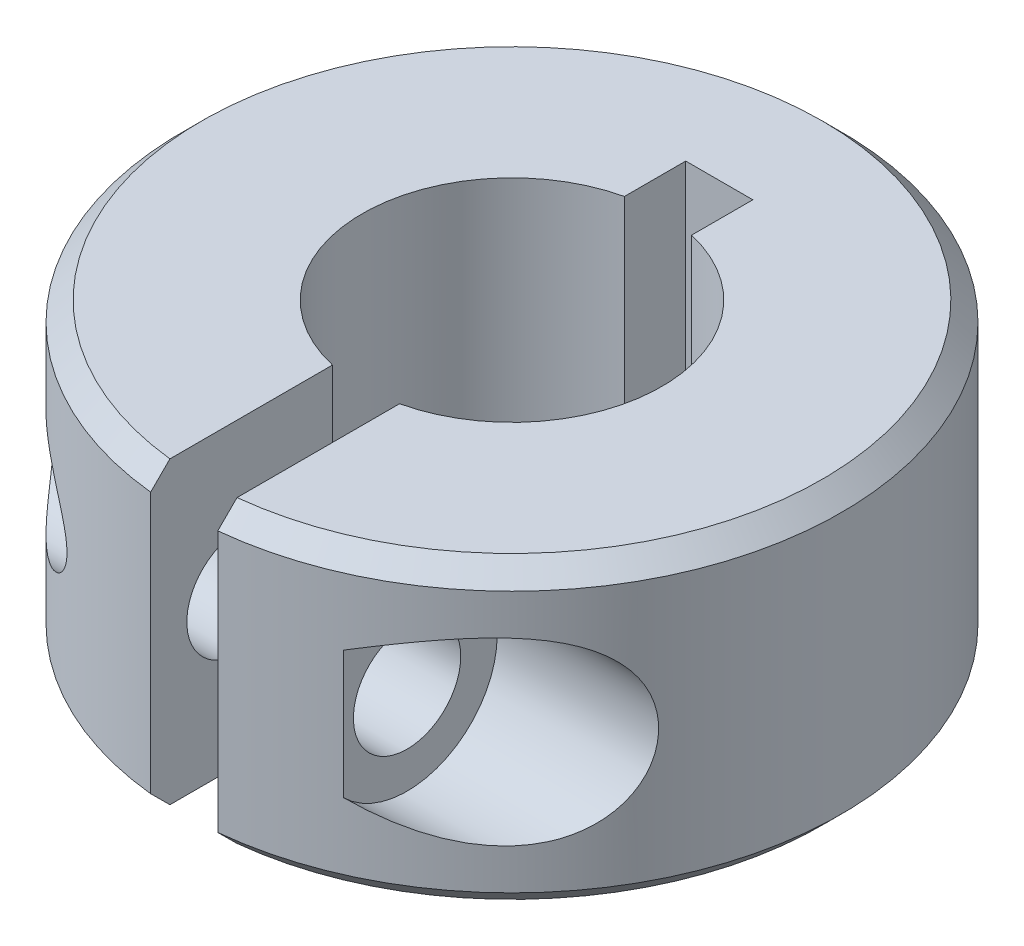
ISO-10303-21;
HEADER;
FILE_DESCRIPTION(('STEP AP214'),'2;1');
FILE_NAME('part.step','',(''),(''),'','','');
FILE_SCHEMA(('AUTOMOTIVE_DESIGN { 1 0 10303 214 1 1 1 1 }'));
ENDSEC;
DATA;
#1=APPLICATION_CONTEXT('core data for automotive mechanical design processes');
#2=APPLICATION_PROTOCOL_DEFINITION('international standard','automotive_design',2000,#1);
#3=PRODUCT_CONTEXT('',#1,'mechanical');
#4=PRODUCT('Part','Part','',(#3));
#5=PRODUCT_RELATED_PRODUCT_CATEGORY('part','',(#4));
#6=PRODUCT_DEFINITION_FORMATION('','',#4);
#7=PRODUCT_DEFINITION_CONTEXT('part definition',#1,'design');
#8=PRODUCT_DEFINITION('design','',#6,#7);
#9=PRODUCT_DEFINITION_SHAPE('','',#8);
#10=(LENGTH_UNIT() NAMED_UNIT(*) SI_UNIT(.MILLI.,.METRE.));
#11=(NAMED_UNIT(*) PLANE_ANGLE_UNIT() SI_UNIT($,.RADIAN.));
#12=(NAMED_UNIT(*) SI_UNIT($,.STERADIAN.) SOLID_ANGLE_UNIT());
#13=UNCERTAINTY_MEASURE_WITH_UNIT(LENGTH_MEASURE(1.E-05),#10,'distance_accuracy_value','');
#14=(GEOMETRIC_REPRESENTATION_CONTEXT(3) GLOBAL_UNCERTAINTY_ASSIGNED_CONTEXT((#13)) GLOBAL_UNIT_ASSIGNED_CONTEXT((#10,
#11,#12)) REPRESENTATION_CONTEXT('',''));
#15=CARTESIAN_POINT('',(0.,0.,0.));
#16=DIRECTION('',(0.,0.,1.));
#17=DIRECTION('',(1.,0.,0.));
#18=AXIS2_PLACEMENT_3D('',#15,#16,#17);
#19=CARTESIAN_POINT('',(0.889000000000001,0.,-3.86790066605904));
#20=DIRECTION('',(1.,0.,0.));
#21=DIRECTION('',(0.,0.,-1.));
#22=AXIS2_PLACEMENT_3D('',#19,#20,#21);
#23=PLANE('',#22);
#24=DIRECTION('',(0.,1.,0.));
#25=VECTOR('',#24,1.);
#26=CARTESIAN_POINT('',(0.889000000000001,0.,-5.49275));
#27=LINE('',#26,#25);
#28=CARTESIAN_POINT('',(0.889000000000001,7.9375,-5.49275));
#29=VERTEX_POINT('',#28);
#30=CARTESIAN_POINT('',(0.889000000000001,0.,-5.49275));
#31=VERTEX_POINT('',#30);
#32=EDGE_CURVE('E121',#29,#31,#27,.F.);
#33=ORIENTED_EDGE('',*,*,#32,.T.);
#34=DIRECTION('',(0.,0.,-1.));
#35=VECTOR('',#34,1.);
#36=CARTESIAN_POINT('',(0.889000000000001,0.,-3.86790066605904));
#37=LINE('',#36,#35);
#38=CARTESIAN_POINT('',(0.889000000000001,0.,-3.86790066605904));
#39=VERTEX_POINT('',#38);
#40=EDGE_CURVE('E107',#39,#31,#37,.T.);
#41=ORIENTED_EDGE('',*,*,#40,.F.);
#42=DIRECTION('',(0.,-1.,0.));
#43=VECTOR('',#42,1.);
#44=CARTESIAN_POINT('',(0.889000000000001,7.9375,-3.86790066605904));
#45=LINE('',#44,#43);
#46=CARTESIAN_POINT('',(0.889000000000001,7.9375,-3.86790066605904));
#47=VERTEX_POINT('',#46);
#48=EDGE_CURVE('E259',#39,#47,#45,.F.);
#49=ORIENTED_EDGE('',*,*,#48,.T.);
#50=DIRECTION('',(0.,0.,-1.));
#51=VECTOR('',#50,1.);
#52=CARTESIAN_POINT('',(0.889000000000001,7.9375,-3.86790066605904));
#53=LINE('',#52,#51);
#54=EDGE_CURVE('E118',#29,#47,#53,.F.);
#55=ORIENTED_EDGE('',*,*,#54,.F.);
#56=EDGE_LOOP('',(#33,#41,#49,#55));
#57=FACE_BOUND('',#56,.T.);
#58=ADVANCED_FACE('F16',(#57),#23,.F.);
#59=CARTESIAN_POINT('',(-8.73125,3.96875,6.30462390896852));
#60=DIRECTION('',(1.,0.,0.));
#61=DIRECTION('',(0.,0.,-1.));
#62=AXIS2_PLACEMENT_3D('',#59,#60,#61);
#63=CYLINDRICAL_SURFACE('',#62,1.4224);
#64=CARTESIAN_POINT('',(0.889000000000001,3.96875,6.30462390896852));
#65=DIRECTION('',(1.,0.,0.));
#66=DIRECTION('',(0.,0.,-1.));
#67=AXIS2_PLACEMENT_3D('',#64,#65,#66);
#68=CIRCLE('',#67,1.4224);
#69=CARTESIAN_POINT('',(0.889000000000001,3.96875,4.88222390896852));
#70=VERTEX_POINT('',#69);
#71=EDGE_CURVE('E19',#70,#70,#68,.F.);
#72=ORIENTED_EDGE('',*,*,#71,.T.);
#73=EDGE_LOOP('',(#72));
#74=FACE_BOUND('',#73,.T.);
#75=CARTESIAN_POINT('',(3.52425,3.96875,6.30462390896852));
#76=DIRECTION('',(1.,0.,0.));
#77=DIRECTION('',(0.,0.,-1.));
#78=AXIS2_PLACEMENT_3D('',#75,#76,#77);
#79=CIRCLE('',#78,1.4224);
#80=CARTESIAN_POINT('',(3.52425,3.96875,4.88222390896852));
#81=VERTEX_POINT('',#80);
#82=EDGE_CURVE('E209',#81,#81,#79,.F.);
#83=ORIENTED_EDGE('',*,*,#82,.F.);
#84=EDGE_LOOP('',(#83));
#85=FACE_BOUND('',#84,.T.);
#86=ADVANCED_FACE('F292',(#74,#85),#63,.F.);
#87=CARTESIAN_POINT('',(-0.889000000000001,0.,-3.86790066605904));
#88=DIRECTION('',(-1.,0.,0.));
#89=DIRECTION('',(0.,0.,1.));
#90=AXIS2_PLACEMENT_3D('',#87,#88,#89);
#91=PLANE('',#90);
#92=DIRECTION('',(0.,-1.,0.));
#93=VECTOR('',#92,1.);
#94=CARTESIAN_POINT('',(-0.889000000000003,7.9375,-3.86790066605904));
#95=LINE('',#94,#93);
#96=CARTESIAN_POINT('',(-0.889000000000002,7.9375,-3.86790066605904));
#97=VERTEX_POINT('',#96);
#98=CARTESIAN_POINT('',(-0.889000000000002,0.,-3.86790066605904));
#99=VERTEX_POINT('',#98);
#100=EDGE_CURVE('E131',#97,#99,#95,.T.);
#101=ORIENTED_EDGE('',*,*,#100,.T.);
#102=DIRECTION('',(0.,0.,1.));
#103=VECTOR('',#102,1.);
#104=CARTESIAN_POINT('',(-0.889000000000001,0.,-3.86790066605904));
#105=LINE('',#104,#103);
#106=CARTESIAN_POINT('',(-0.889000000000001,0.,-5.49275));
#107=VERTEX_POINT('',#106);
#108=EDGE_CURVE('E102',#107,#99,#105,.T.);
#109=ORIENTED_EDGE('',*,*,#108,.F.);
#110=DIRECTION('',(0.,1.,0.));
#111=VECTOR('',#110,1.);
#112=CARTESIAN_POINT('',(-0.889000000000001,0.,-5.49275));
#113=LINE('',#112,#111);
#114=CARTESIAN_POINT('',(-0.889000000000001,7.9375,-5.49275));
#115=VERTEX_POINT('',#114);
#116=EDGE_CURVE('E97',#107,#115,#113,.T.);
#117=ORIENTED_EDGE('',*,*,#116,.T.);
#118=DIRECTION('',(0.,0.,1.));
#119=VECTOR('',#118,1.);
#120=CARTESIAN_POINT('',(-0.889000000000001,7.9375,0.));
#121=LINE('',#120,#119);
#122=EDGE_CURVE('E245',#97,#115,#121,.F.);
#123=ORIENTED_EDGE('',*,*,#122,.F.);
#124=EDGE_LOOP('',(#101,#109,#117,#123));
#125=FACE_BOUND('',#124,.T.);
#126=ADVANCED_FACE('F294',(#125),#91,.F.);
#127=CARTESIAN_POINT('',(-0.889000000000001,0.,-5.49275));
#128=DIRECTION('',(0.,0.,-1.));
#129=DIRECTION('',(-1.,0.,0.));
#130=AXIS2_PLACEMENT_3D('',#127,#128,#129);
#131=PLANE('',#130);
#132=ORIENTED_EDGE('',*,*,#116,.F.);
#133=DIRECTION('',(1.,0.,0.));
#134=VECTOR('',#133,1.);
#135=CARTESIAN_POINT('',(0.,0.,-5.49275));
#136=LINE('',#135,#134);
#137=EDGE_CURVE('E112',#107,#31,#136,.T.);
#138=ORIENTED_EDGE('',*,*,#137,.T.);
#139=ORIENTED_EDGE('',*,*,#32,.F.);
#140=DIRECTION('',(1.,0.,0.));
#141=VECTOR('',#140,1.);
#142=CARTESIAN_POINT('',(0.,7.9375,-5.49275));
#143=LINE('',#142,#141);
#144=EDGE_CURVE('E248',#115,#29,#143,.T.);
#145=ORIENTED_EDGE('',*,*,#144,.F.);
#146=EDGE_LOOP('',(#132,#138,#139,#145));
#147=FACE_BOUND('',#146,.T.);
#148=ADVANCED_FACE('F125',(#147),#131,.F.);
#149=CARTESIAN_POINT('',(0.,7.9375,0.));
#150=DIRECTION('',(0.,-1.,0.));
#151=DIRECTION('',(0.,0.,-1.));
#152=AXIS2_PLACEMENT_3D('',#149,#150,#151);
#153=CYLINDRICAL_SURFACE('',#152,3.96875);
#154=CARTESIAN_POINT('',(0.,7.9375,0.));
#155=DIRECTION('',(0.,-1.,0.));
#156=DIRECTION('',(0.,0.,-1.));
#157=AXIS2_PLACEMENT_3D('',#154,#155,#156);
#158=CIRCLE('',#157,3.96875);
#159=CARTESIAN_POINT('',(0.889,7.9375,3.86790066605904));
#160=VERTEX_POINT('',#159);
#161=EDGE_CURVE('E267',#47,#160,#158,.T.);
#162=ORIENTED_EDGE('',*,*,#161,.F.);
#163=ORIENTED_EDGE('',*,*,#48,.F.);
#164=CARTESIAN_POINT('',(0.,0.,0.));
#165=DIRECTION('',(0.,-1.,0.));
#166=DIRECTION('',(0.,0.,-1.));
#167=AXIS2_PLACEMENT_3D('',#164,#165,#166);
#168=CIRCLE('',#167,3.96875);
#169=CARTESIAN_POINT('',(0.889,0.,3.86790066605904));
#170=VERTEX_POINT('',#169);
#171=EDGE_CURVE('E114',#39,#170,#168,.T.);
#172=ORIENTED_EDGE('',*,*,#171,.T.);
#173=DIRECTION('',(0.,1.,0.));
#174=VECTOR('',#173,1.);
#175=CARTESIAN_POINT('',(0.889,0.,3.86790066605904));
#176=LINE('',#175,#174);
#177=EDGE_CURVE('E257',#170,#160,#176,.T.);
#178=ORIENTED_EDGE('',*,*,#177,.T.);
#179=EDGE_LOOP('',(#162,#163,#172,#178));
#180=FACE_BOUND('',#179,.T.);
#181=ADVANCED_FACE('F194',(#180),#153,.F.);
#182=CARTESIAN_POINT('',(0.889,0.,3.86790066605904));
#183=DIRECTION('',(1.,0.,0.));
#184=DIRECTION('',(0.,0.,-1.));
#185=AXIS2_PLACEMENT_3D('',#182,#183,#184);
#186=PLANE('',#185);
#187=CARTESIAN_POINT('',(0.889,0.508000000000003,8.68587390896852));
#188=CARTESIAN_POINT('',(0.889,0.423319137776069,8.60075149357472));
#189=CARTESIAN_POINT('',(0.889,0.338645373339582,8.51562201956594));
#190=CARTESIAN_POINT('',(0.889,0.169312040006242,8.345348954283));
#191=CARTESIAN_POINT('',(0.889,0.0846524711093933,8.26020536300881));
#192=CARTESIAN_POINT('',(0.889,0.,8.17505471311966));
#193=B_SPLINE_CURVE_WITH_KNOTS('',3,(#187,#188,#189,#190,#191,#192),.UNSPECIFIED.,.F.,.F.,(4,2,
4),(0.,0.360208361312868,0.720416722775766),.UNSPECIFIED.);
#194=CARTESIAN_POINT('',(0.889,0.508000000000003,8.68587390896852));
#195=VERTEX_POINT('',#194);
#196=CARTESIAN_POINT('',(0.889,0.,8.17505471311966));
#197=VERTEX_POINT('',#196);
#198=EDGE_CURVE('E204',#195,#197,#193,.T.);
#199=ORIENTED_EDGE('',*,*,#198,.F.);
#200=DIRECTION('',(0.,-1.,0.));
#201=VECTOR('',#200,1.);
#202=CARTESIAN_POINT('',(0.888999999999999,7.9375,8.68587390896852));
#203=LINE('',#202,#201);
#204=CARTESIAN_POINT('',(0.889,7.4295,8.68587390896852));
#205=VERTEX_POINT('',#204);
#206=EDGE_CURVE('E273',#205,#195,#203,.T.);
#207=ORIENTED_EDGE('',*,*,#206,.F.);
#208=CARTESIAN_POINT('',(0.889,7.9375,8.17505471311966));
#209=CARTESIAN_POINT('',(0.889,7.85284752889061,8.26020536300882));
#210=CARTESIAN_POINT('',(0.889,7.76818795999376,8.345348954283));
#211=CARTESIAN_POINT('',(0.889,7.59885462666042,8.51562201956595));
#212=CARTESIAN_POINT('',(0.889,7.51418086222393,8.60075149357472));
#213=CARTESIAN_POINT('',(0.889,7.4295,8.68587390896852));
#214=B_SPLINE_CURVE_WITH_KNOTS('',3,(#208,#209,#210,#211,#212,#213),.UNSPECIFIED.,.F.,.F.,(4,2,
4),(0.,0.360208361462896,0.720416722775761),.UNSPECIFIED.);
#215=CARTESIAN_POINT('',(0.889,7.9375,8.17505471311966));
#216=VERTEX_POINT('',#215);
#217=EDGE_CURVE('E199',#216,#205,#214,.T.);
#218=ORIENTED_EDGE('',*,*,#217,.F.);
#219=DIRECTION('',(0.,0.,1.));
#220=VECTOR('',#219,1.);
#221=CARTESIAN_POINT('',(0.889,7.9375,0.));
#222=LINE('',#221,#220);
#223=EDGE_CURVE('E249',#160,#216,#222,.T.);
#224=ORIENTED_EDGE('',*,*,#223,.F.);
#225=ORIENTED_EDGE('',*,*,#177,.F.);
#226=DIRECTION('',(0.,0.,1.));
#227=VECTOR('',#226,1.);
#228=CARTESIAN_POINT('',(0.889,0.,0.));
#229=LINE('',#228,#227);
#230=EDGE_CURVE('E128',#170,#197,#229,.T.);
#231=ORIENTED_EDGE('',*,*,#230,.T.);
#232=EDGE_LOOP('',(#199,#207,#218,#224,#225,#231));
#233=FACE_BOUND('',#232,.T.);
#234=ORIENTED_EDGE('',*,*,#71,.F.);
#235=EDGE_LOOP('',(#234));
#236=FACE_BOUND('',#235,.T.);
#237=ADVANCED_FACE('F189',(#233,#236),#186,.F.);
#238=CARTESIAN_POINT('',(3.52425,3.96875,6.30462390896852));
#239=DIRECTION('',(1.,0.,0.));
#240=DIRECTION('',(0.,0.,-1.));
#241=AXIS2_PLACEMENT_3D('',#238,#239,#240);
#242=PLANE('',#241);
#243=CARTESIAN_POINT('',(3.52425,3.96875,6.30462390896852));
#244=DIRECTION('',(1.,0.,0.));
#245=DIRECTION('',(0.,0.,-1.));
#246=AXIS2_PLACEMENT_3D('',#243,#244,#245);
#247=CIRCLE('',#246,2.3876);
#248=CARTESIAN_POINT('',(3.52425,2.27595272289127,7.98839085798886));
#249=VERTEX_POINT('',#248);
#250=CARTESIAN_POINT('',(3.52425,5.66154727710873,7.98839085798886));
#251=VERTEX_POINT('',#250);
#252=EDGE_CURVE('E254',#249,#251,#247,.T.);
#253=ORIENTED_EDGE('',*,*,#252,.T.);
#254=DIRECTION('',(0.,-1.,0.));
#255=VECTOR('',#254,1.);
#256=CARTESIAN_POINT('',(3.52425,7.9375,7.98839085798886));
#257=LINE('',#256,#255);
#258=EDGE_CURVE('E176',#249,#251,#257,.F.);
#259=ORIENTED_EDGE('',*,*,#258,.F.);
#260=EDGE_LOOP('',(#253,#259));
#261=FACE_BOUND('',#260,.T.);
#262=ORIENTED_EDGE('',*,*,#82,.T.);
#263=EDGE_LOOP('',(#262));
#264=FACE_BOUND('',#263,.T.);
#265=ADVANCED_FACE('F184',(#261,#264),#242,.T.);
#266=CARTESIAN_POINT('',(3.52425,3.96875,6.30462390896852));
#267=DIRECTION('',(1.,0.,0.));
#268=DIRECTION('',(0.,0.,-1.));
#269=AXIS2_PLACEMENT_3D('',#266,#267,#268);
#270=CYLINDRICAL_SURFACE('',#269,2.3876);
#271=ORIENTED_EDGE('',*,*,#252,.F.);
#272=CARTESIAN_POINT('',(3.52425,5.66154727710873,7.98839085798886));
#273=CARTESIAN_POINT('',(3.60955958781835,5.69897817429687,7.95075361999166));
#274=CARTESIAN_POINT('',(3.6946179095307,5.73543510990499,7.91159660556692));
#275=CARTESIAN_POINT('',(3.86417001321675,5.80619840605255,7.83018319828249));
#276=CARTESIAN_POINT('',(3.94866366066445,5.84050426937678,7.78792609370683));
#277=CARTESIAN_POINT('',(4.20174379855807,5.94010123017973,7.6561304529581));
#278=CARTESIAN_POINT('',(4.36932193329383,6.00180258138981,7.56183431054299));
#279=CARTESIAN_POINT('',(4.70309261638825,6.11412707066081,7.3589635432753));
#280=CARTESIAN_POINT('',(4.8692306622938,6.16457830016288,7.25020323234772));
#281=CARTESIAN_POINT('',(5.1960771952028,6.25008052782633,7.01964204793016));
#282=CARTESIAN_POINT('',(5.35679483675437,6.28515882991363,6.89786477655299));
#283=CARTESIAN_POINT('',(5.59591489345711,6.32384372945245,6.70310731903988));
#284=CARTESIAN_POINT('',(5.67690665496947,6.33447792424138,6.6346603309589));
#285=CARTESIAN_POINT('',(5.83665093681497,6.34982573287133,6.49457794977716));
#286=CARTESIAN_POINT('',(5.9154033818158,6.3545391477626,6.4229424496199));
#287=CARTESIAN_POINT('',(6.14713557312967,6.35867626395523,6.20421044077621));
#288=CARTESIAN_POINT('',(6.29637986936049,6.3482372316172,6.05264609188777));
#289=CARTESIAN_POINT('',(6.55575211977904,6.29922675028537,5.76949159605136));
#290=CARTESIAN_POINT('',(6.6681440258824,6.26592410624799,5.63907470261551));
#291=CARTESIAN_POINT('',(6.88087712436703,6.17331337752463,5.37740986931163));
#292=CARTESIAN_POINT('',(6.9812269858996,6.11402414557097,5.24616259976985));
#293=CARTESIAN_POINT('',(7.14975664635442,5.98057264686023,5.01322536753556));
#294=CARTESIAN_POINT('',(7.22044555696095,5.91124789670603,4.91058882021657));
#295=CARTESIAN_POINT('',(7.35070119528867,5.75325979020072,4.71337027162313));
#296=CARTESIAN_POINT('',(7.41027328115917,5.66460579517901,4.61878440205706));
#297=CARTESIAN_POINT('',(7.51757921500565,5.46836997996353,4.44201726544415));
#298=CARTESIAN_POINT('',(7.56524515969285,5.36068531569658,4.35990815151961));
#299=CARTESIAN_POINT('',(7.64772711073278,5.12927020745979,4.21356144763949));
#300=CARTESIAN_POINT('',(7.68254062677809,5.00553666010202,4.14932732176365));
#301=CARTESIAN_POINT('',(7.7362026523415,4.75965297197077,4.04831243014543));
#302=CARTESIAN_POINT('',(7.75632747891074,4.63865585390273,4.0093833938649));
#303=CARTESIAN_POINT('',(7.78611217283893,4.39099695225207,3.95123692026284));
#304=CARTESIAN_POINT('',(7.79580158762413,4.26435222564371,3.93196383620823));
#305=CARTESIAN_POINT('',(7.80132205687367,4.10902961494527,3.92098178768837));
#306=CARTESIAN_POINT('',(7.80206741749747,4.08100209266428,3.9194989024328));
#307=CARTESIAN_POINT('',(7.80306156892032,4.02490309477338,3.91751938070139));
#308=CARTESIAN_POINT('',(7.80331036003693,3.9968316191916,3.91702274359486));
#309=CARTESIAN_POINT('',(7.80330956902325,3.84714664720276,3.91702895544903));
#310=CARTESIAN_POINT('',(7.79864082109076,3.72535308178364,3.92636877711967));
#311=CARTESIAN_POINT('',(7.77991152346026,3.48513153736816,3.96334687224039));
#312=CARTESIAN_POINT('',(7.76582873817507,3.36671222027772,3.9910284668743));
#313=CARTESIAN_POINT('',(7.72822910478191,3.13700351775894,4.06335405862364));
#314=CARTESIAN_POINT('',(7.70473071762061,3.02570067154157,4.10796485405241));
#315=CARTESIAN_POINT('',(7.64832204027555,2.81298272319236,4.21205180994303));
#316=CARTESIAN_POINT('',(7.61541675376247,2.71156240275075,4.27152006538494));
#317=CARTESIAN_POINT('',(7.53955606182292,2.51876064947771,4.40406100426165));
#318=CARTESIAN_POINT('',(7.49640150310547,2.42763908250883,4.47739650049554));
#319=CARTESIAN_POINT('',(7.40087401894999,2.25952125612247,4.63359072967538));
#320=CARTESIAN_POINT('',(7.34849819375723,2.18252945560605,4.71645245542321));
#321=CARTESIAN_POINT('',(7.2305129679845,2.03752579766119,4.89559258140718));
#322=CARTESIAN_POINT('',(7.16416565328853,1.9707913250359,4.99241370502222));
#323=CARTESIAN_POINT('',(7.02256732967787,1.85434041525347,5.18970363481054));
#324=CARTESIAN_POINT('',(6.94731121610181,1.80463379903506,5.29017450918332));
#325=CARTESIAN_POINT('',(6.81079155240291,1.73257769180798,5.4641136755008));
#326=CARTESIAN_POINT('',(6.75131294354525,1.70646432192494,5.53746963762525));
#327=CARTESIAN_POINT('',(6.62878259150267,1.66207078370359,5.68357976680033));
#328=CARTESIAN_POINT('',(6.56572958051644,1.64379341464116,5.75633370970307));
#329=CARTESIAN_POINT('',(6.37170729718585,1.59974886863461,5.97272753876204));
#330=CARTESIAN_POINT('',(6.23595831957509,1.58481095526405,6.11439230455093));
#331=CARTESIAN_POINT('',(5.99628695403204,1.57957765262868,6.34812171410398));
#332=CARTESIAN_POINT('',(5.89466669346199,1.58335328241578,6.44257602317717));
#333=CARTESIAN_POINT('',(5.6875223450108,1.60110478031693,6.62615778394628));
#334=CARTESIAN_POINT('',(5.58199651504965,1.6150852536507,6.71528281100257));
#335=CARTESIAN_POINT('',(5.26006188600812,1.67020204490328,6.97440824932173));
#336=CARTESIAN_POINT('',(5.03876486462159,1.72450968019027,7.1357034724889));
#337=CARTESIAN_POINT('',(4.70840213052546,1.82278010213495,7.35402245467164));
#338=CARTESIAN_POINT('',(4.60241861442455,1.8568156391696,7.42078240806345));
#339=CARTESIAN_POINT('',(4.38888748297069,1.92974904899498,7.54903124831615));
#340=CARTESIAN_POINT('',(4.28133970510873,1.96864743021465,7.61051958287426));
#341=CARTESIAN_POINT('',(4.06606433693254,2.05024735881438,7.72766000947135));
#342=CARTESIAN_POINT('',(3.95834886601975,2.09290784281385,7.78336344869486));
#343=CARTESIAN_POINT('',(3.74196978872883,2.18184066500025,7.88967068263148));
#344=CARTESIAN_POINT('',(3.63330668491121,2.22811118118269,7.94027702071072));
#345=CARTESIAN_POINT('',(3.52424999999991,2.27595272289088,7.9883908579889));
#346=B_SPLINE_CURVE_WITH_KNOTS('',3,(#272,#273,#274,#275,#276,#277,#278,#279,#280,#281,#282,
#283,#284,#285,#286,#287,#288,#289,#290,#291,#292,#293,#294,#295,#296,#297,#298,#299,#300,#301,
#302,#303,#304,#305,#306,#307,#308,#309,#310,#311,#312,#313,#314,#315,#316,#317,#318,#319,#320,
#321,#322,#323,#324,#325,#326,#327,#328,#329,#330,#331,#332,#333,#334,#335,#336,#337,#338,#339,
#340,#341,#342,#343,#344,#345),.UNSPECIFIED.,.F.,.F.,(4,2,2,2,2,2,2,2,2,2,2,2,2,2,2,2,2,2,2,2,2,
2,2,2,2,2,2,2,2,2,2,2,2,2,2,2,4),(0.,0.301393036921289,0.602855485240296,1.20792266072896,
1.82168340377248,2.43434958146114,2.753853136523,3.07336742724095,3.70933849285697,
4.23349582386274,4.75727351735555,5.18334567583689,5.60921194024947,6.0374542339468,
6.46577946106991,6.84992587964808,7.23298172095967,7.31720075895448,7.40141974309254,
7.76611776034739,8.13168023804906,8.4965294461325,8.86118494540089,9.23360822062376,
9.60614881935743,10.0096385797249,10.4133606654457,10.7069240323887,11.0005921825653,
11.588349458801,12.0042219335821,12.4202821985136,13.2543409077894,13.6436209456572,
14.032941718333,14.4184423256064,14.8037496116657),.UNSPECIFIED.);
#347=EDGE_CURVE('E167',#251,#249,#346,.T.);
#348=ORIENTED_EDGE('',*,*,#347,.F.);
#349=EDGE_LOOP('',(#271,#348));
#350=FACE_BOUND('',#349,.T.);
#351=ADVANCED_FACE('F178',(#350),#270,.F.);
#352=CARTESIAN_POINT('',(0.,7.9375,0.));
#353=DIRECTION('',(0.,1.,0.));
#354=DIRECTION('',(0.,0.,1.));
#355=AXIS2_PLACEMENT_3D('',#352,#353,#354);
#356=PLANE('',#355);
#357=ORIENTED_EDGE('',*,*,#54,.T.);
#358=ORIENTED_EDGE('',*,*,#161,.T.);
#359=ORIENTED_EDGE('',*,*,#223,.T.);
#360=CARTESIAN_POINT('',(0.,7.9375,0.));
#361=DIRECTION('',(0.,-1.,0.));
#362=DIRECTION('',(0.,0.,-1.));
#363=AXIS2_PLACEMENT_3D('',#360,#361,#362);
#364=CIRCLE('',#363,8.22325);
#365=CARTESIAN_POINT('',(-0.889,7.9375,8.17505471311966));
#366=VERTEX_POINT('',#365);
#367=EDGE_CURVE('E90',#366,#216,#364,.T.);
#368=ORIENTED_EDGE('',*,*,#367,.F.);
#369=DIRECTION('',(0.,0.,1.));
#370=VECTOR('',#369,1.);
#371=CARTESIAN_POINT('',(-0.889,7.9375,3.86790066605904));
#372=LINE('',#371,#370);
#373=CARTESIAN_POINT('',(-0.889,7.9375,3.86790066605904));
#374=VERTEX_POINT('',#373);
#375=EDGE_CURVE('E222',#366,#374,#372,.F.);
#376=ORIENTED_EDGE('',*,*,#375,.T.);
#377=CARTESIAN_POINT('',(0.,7.9375,0.));
#378=DIRECTION('',(0.,-1.,0.));
#379=DIRECTION('',(0.,0.,-1.));
#380=AXIS2_PLACEMENT_3D('',#377,#378,#379);
#381=CIRCLE('',#380,3.96875);
#382=EDGE_CURVE('E262',#374,#97,#381,.T.);
#383=ORIENTED_EDGE('',*,*,#382,.T.);
#384=ORIENTED_EDGE('',*,*,#122,.T.);
#385=ORIENTED_EDGE('',*,*,#144,.T.);
#386=EDGE_LOOP('',(#357,#358,#359,#368,#376,#383,#384,#385));
#387=FACE_BOUND('',#386,.T.);
#388=ADVANCED_FACE('F183',(#387),#356,.T.);
#389=CARTESIAN_POINT('',(0.,7.9375,0.));
#390=DIRECTION('',(0.,-1.,0.));
#391=DIRECTION('',(0.,0.,-1.));
#392=AXIS2_PLACEMENT_3D('',#389,#390,#391);
#393=CYLINDRICAL_SURFACE('',#392,3.96875);
#394=CARTESIAN_POINT('',(0.,0.,0.));
#395=DIRECTION('',(0.,-1.,0.));
#396=DIRECTION('',(0.,0.,-1.));
#397=AXIS2_PLACEMENT_3D('',#394,#395,#396);
#398=CIRCLE('',#397,3.96875);
#399=CARTESIAN_POINT('',(-0.889,0.,3.86790066605904));
#400=VERTEX_POINT('',#399);
#401=EDGE_CURVE('E126',#400,#99,#398,.T.);
#402=ORIENTED_EDGE('',*,*,#401,.T.);
#403=ORIENTED_EDGE('',*,*,#100,.F.);
#404=ORIENTED_EDGE('',*,*,#382,.F.);
#405=DIRECTION('',(0.,1.,0.));
#406=VECTOR('',#405,1.);
#407=CARTESIAN_POINT('',(-0.889,0.,3.86790066605904));
#408=LINE('',#407,#406);
#409=EDGE_CURVE('E236',#374,#400,#408,.F.);
#410=ORIENTED_EDGE('',*,*,#409,.T.);
#411=EDGE_LOOP('',(#402,#403,#404,#410));
#412=FACE_BOUND('',#411,.T.);
#413=ADVANCED_FACE('F330',(#412),#393,.F.);
#414=CARTESIAN_POINT('',(0.,0.,0.));
#415=DIRECTION('',(0.,1.,0.));
#416=DIRECTION('',(0.,0.,1.));
#417=AXIS2_PLACEMENT_3D('',#414,#415,#416);
#418=PLANE('',#417);
#419=CARTESIAN_POINT('',(0.,0.,0.));
#420=DIRECTION('',(0.,1.,0.));
#421=DIRECTION('',(0.,0.,1.));
#422=AXIS2_PLACEMENT_3D('',#419,#420,#421);
#423=CIRCLE('',#422,8.22324999999999);
#424=CARTESIAN_POINT('',(-0.889,0.,8.17505471311966));
#425=VERTEX_POINT('',#424);
#426=EDGE_CURVE('E175',#197,#425,#423,.T.);
#427=ORIENTED_EDGE('',*,*,#426,.F.);
#428=ORIENTED_EDGE('',*,*,#230,.F.);
#429=ORIENTED_EDGE('',*,*,#171,.F.);
#430=ORIENTED_EDGE('',*,*,#40,.T.);
#431=ORIENTED_EDGE('',*,*,#137,.F.);
#432=ORIENTED_EDGE('',*,*,#108,.T.);
#433=ORIENTED_EDGE('',*,*,#401,.F.);
#434=DIRECTION('',(0.,0.,1.));
#435=VECTOR('',#434,1.);
#436=CARTESIAN_POINT('',(-0.889,0.,3.86790066605904));
#437=LINE('',#436,#435);
#438=EDGE_CURVE('E233',#400,#425,#437,.T.);
#439=ORIENTED_EDGE('',*,*,#438,.T.);
#440=EDGE_LOOP('',(#427,#428,#429,#430,#431,#432,#433,#439));
#441=FACE_BOUND('',#440,.T.);
#442=ADVANCED_FACE('F110',(#441),#418,.F.);
#443=CARTESIAN_POINT('',(-8.73125,3.96875,6.30462390896852));
#444=DIRECTION('',(1.,0.,0.));
#445=DIRECTION('',(0.,0.,-1.));
#446=AXIS2_PLACEMENT_3D('',#443,#444,#445);
#447=CYLINDRICAL_SURFACE('',#446,1.4224);
#448=CARTESIAN_POINT('',(-0.889000000000001,3.96875,6.30462390896852));
#449=DIRECTION('',(1.,0.,0.));
#450=DIRECTION('',(0.,0.,-1.));
#451=AXIS2_PLACEMENT_3D('',#448,#449,#450);
#452=CIRCLE('',#451,1.4224);
#453=CARTESIAN_POINT('',(-0.889000000000001,3.96875,4.88222390896852));
#454=VERTEX_POINT('',#453);
#455=EDGE_CURVE('E223',#454,#454,#452,.T.);
#456=ORIENTED_EDGE('',*,*,#455,.T.);
#457=EDGE_LOOP('',(#456));
#458=FACE_BOUND('',#457,.T.);
#459=CARTESIAN_POINT('',(-7.23868884986751,3.96875,4.88222390896852));
#460=CARTESIAN_POINT('',(-7.2386870744518,4.0378899497126,4.8822279101714));
#461=CARTESIAN_POINT('',(-7.23527592445189,4.10707939861441,4.88729594642728));
#462=CARTESIAN_POINT('',(-7.22173214206303,4.2433852346912,4.90728541258712));
#463=CARTESIAN_POINT('',(-7.21159180749265,4.31049915399255,4.92221813345716));
#464=CARTESIAN_POINT('',(-7.18494921094578,4.4405059500377,4.96102591865221));
#465=CARTESIAN_POINT('',(-7.16846659295481,4.50341116309504,4.98487336491982));
#466=CARTESIAN_POINT('',(-7.12962902970383,4.62373469852429,5.04026343305277));
#467=CARTESIAN_POINT('',(-7.10727443597481,4.68115334907354,5.07180559425919));
#468=CARTESIAN_POINT('',(-7.05610444318853,4.79207244827926,5.14277262550893));
#469=CARTESIAN_POINT('',(-7.02703445136188,4.84526122738559,5.18249866291124));
#470=CARTESIAN_POINT('',(-6.96384326956214,4.94394890187736,5.26710644247552));
#471=CARTESIAN_POINT('',(-6.92971943824912,4.98944374931175,5.31199087785936));
#472=CARTESIAN_POINT('',(-6.84240429624704,5.08945256321543,5.42430556387432));
#473=CARTESIAN_POINT('',(-6.7870908582683,5.14014711797571,5.49349980339086));
#474=CARTESIAN_POINT('',(-6.66974319061666,5.22664741644416,5.63540507680681));
#475=CARTESIAN_POINT('',(-6.60769664844529,5.26242528420238,5.70812241415444));
#476=CARTESIAN_POINT('',(-6.45742146897573,5.32971918766051,5.87818678635397));
#477=CARTESIAN_POINT('',(-6.36724178608741,5.35606240652902,5.97585055603678));
#478=CARTESIAN_POINT('',(-6.18076812024327,5.38800130849286,6.16854543506036));
#479=CARTESIAN_POINT('',(-6.08446628844238,5.39356978881962,6.26357293102783));
#480=CARTESIAN_POINT('',(-5.85663568280009,5.38579837315034,6.4781206685348));
#481=CARTESIAN_POINT('',(-5.72361940123119,5.36590307648597,6.59585290512121));
#482=CARTESIAN_POINT('',(-5.52202135004795,5.31624452342451,6.76385828809813));
#483=CARTESIAN_POINT('',(-5.4543694419322,5.29634256284721,6.81850627166269));
#484=CARTESIAN_POINT('',(-5.31882837468078,5.25016300288018,6.92475080486306));
#485=CARTESIAN_POINT('',(-5.25093928498578,5.22388713688131,6.97634817937873));
#486=CARTESIAN_POINT('',(-5.12565122128238,5.16946913338944,7.06877309364044));
#487=CARTESIAN_POINT('',(-5.06820584724443,5.14219776134974,7.11005535226839));
#488=CARTESIAN_POINT('',(-4.95396629335835,5.0830208033924,7.19011848713438));
#489=CARTESIAN_POINT('',(-4.89717199174561,5.05111609978276,7.22889983758517));
#490=CARTESIAN_POINT('',(-4.78500447591034,4.98254254396324,7.30362799391044));
#491=CARTESIAN_POINT('',(-4.72962646676912,4.94589335904665,7.33958556784311));
#492=CARTESIAN_POINT('',(-4.62087879635299,4.86727326631023,7.40853151846169));
#493=CARTESIAN_POINT('',(-4.56750737991554,4.82530715657512,7.44152252689584));
#494=CARTESIAN_POINT('',(-4.47306089236438,4.74315003996716,7.49859604599592));
#495=CARTESIAN_POINT('',(-4.43147082178334,4.7039383698091,7.52322621671391));
#496=CARTESIAN_POINT('',(-4.35152597157234,4.62064120689364,7.56974809491585));
#497=CARTESIAN_POINT('',(-4.31317672713756,4.57654766134451,7.59163514687521));
#498=CARTESIAN_POINT('',(-4.24110737619072,4.4821877537138,7.63213343685597));
#499=CARTESIAN_POINT('',(-4.20745633003494,4.43184646639877,7.65069675067093));
#500=CARTESIAN_POINT('',(-4.14854827052546,4.32501930237809,7.68279904532202));
#501=CARTESIAN_POINT('',(-4.12325584542275,4.2685607292152,7.69635925130966));
#502=CARTESIAN_POINT('',(-4.09178173800071,4.17094827383079,7.7131220703924));
#503=CARTESIAN_POINT('',(-4.08201269494705,4.13130311472965,7.71828683063704));
#504=CARTESIAN_POINT('',(-4.06884781664276,4.05068729664022,7.72523540890139));
#505=CARTESIAN_POINT('',(-4.06544334673241,4.00971851030954,7.7270238075803));
#506=CARTESIAN_POINT('',(-4.06544296973609,3.92778709103173,7.72702401034287));
#507=CARTESIAN_POINT('',(-4.06884613182602,3.88682445800912,7.72523630339617));
#508=CARTESIAN_POINT('',(-4.0820086382539,3.80622026888983,7.71828896642203));
#509=CARTESIAN_POINT('',(-4.09177630364546,3.76658051376629,7.71312492208672));
#510=CARTESIAN_POINT('',(-4.12002326734666,3.6789494437887,7.69808094608694));
#511=CARTESIAN_POINT('',(-4.14015935808814,3.63165829285785,7.68729480371635));
#512=CARTESIAN_POINT('',(-4.18662095025765,3.5412944965267,7.66209072022457));
#513=CARTESIAN_POINT('',(-4.2129604610197,3.4982317167231,7.64766455340784));
#514=CARTESIAN_POINT('',(-4.28920552355633,3.38825722503787,7.60528724098857));
#515=CARTESIAN_POINT('',(-4.3429602008818,3.32503024727076,7.57480797552731));
#516=CARTESIAN_POINT('',(-4.4568685320413,3.20797272307032,7.50835882751082));
#517=CARTESIAN_POINT('',(-4.51704060216948,3.15417045776917,7.47237300666925));
#518=CARTESIAN_POINT('',(-4.63519065346608,3.05909246274084,7.39960109738261));
#519=CARTESIAN_POINT('',(-4.69285081216633,3.01711669836928,7.36320187783777));
#520=CARTESIAN_POINT('',(-4.80996842041925,2.93886121258242,7.28723609854791));
#521=CARTESIAN_POINT('',(-4.86942718443178,2.90258578319393,7.24766718572718));
#522=CARTESIAN_POINT('',(-4.9893886679126,2.83528858151708,7.16561336547589));
#523=CARTESIAN_POINT('',(-5.04989236077846,2.80427203530886,7.12312561563729));
#524=CARTESIAN_POINT('',(-5.17134271052456,2.74733802376356,7.0354498730512));
#525=CARTESIAN_POINT('',(-5.23228941799783,2.72142115061497,6.9902615675009));
#526=CARTESIAN_POINT('',(-5.35770830104586,2.67333066360977,6.89465373984954));
#527=CARTESIAN_POINT('',(-5.42218149923827,2.65145833502134,6.84408282491055));
#528=CARTESIAN_POINT('',(-5.5506907674714,2.61358344348162,6.74028247045637));
#529=CARTESIAN_POINT('',(-5.61472675745587,2.59758192865638,6.68705255815141));
#530=CARTESIAN_POINT('',(-5.80538470133999,2.55889825451018,6.52380500910773));
#531=CARTESIAN_POINT('',(-5.93088169514783,2.54541104977895,6.40998310884029));
#532=CARTESIAN_POINT('',(-6.14449308629896,2.54714342688915,6.20452992712717));
#533=CARTESIAN_POINT('',(-6.23414420522111,2.55605948174789,6.11441734310342));
#534=CARTESIAN_POINT('',(-6.40762556723725,2.59280268655358,5.93234834463317));
#535=CARTESIAN_POINT('',(-6.49146294870189,2.62060617573093,5.84039437664655));
#536=CARTESIAN_POINT('',(-6.6329668612694,2.6891787174146,5.67867469308205));
#537=CARTESIAN_POINT('',(-6.69229182245315,2.72565464012055,5.60854804178759));
#538=CARTESIAN_POINT('',(-6.8044473642117,2.81273253414844,5.47192747522425));
#539=CARTESIAN_POINT('',(-6.8572864089364,2.86331580689592,5.40542888968759));
#540=CARTESIAN_POINT('',(-6.94584734423871,2.96845903825628,5.29095392061412));
#541=CARTESIAN_POINT('',(-6.98293221366727,3.02059795277009,5.24181477133697));
#542=CARTESIAN_POINT('',(-7.05064461639469,3.1343351370884,5.15037593165097));
#543=CARTESIAN_POINT('',(-7.08127217515175,3.19593336959752,5.10807621427752));
#544=CARTESIAN_POINT('',(-7.13525015501458,3.32802901280868,5.03240697878443));
#545=CARTESIAN_POINT('',(-7.15854396188283,3.39859002485154,4.99910720336983));
#546=CARTESIAN_POINT('',(-7.1965991998262,3.54619130241324,4.94417047427031));
#547=CARTESIAN_POINT('',(-7.21137823892864,3.62321781674813,4.92250945863112));
#548=CARTESIAN_POINT('',(-7.22727814747999,3.74571874116175,4.89910901773771));
#549=CARTESIAN_POINT('',(-7.23155039111928,3.78997269889491,4.89279377000424));
#550=CARTESIAN_POINT('',(-7.23725619918249,3.87906085925233,4.88435009328593));
#551=CARTESIAN_POINT('',(-7.23869000167986,3.92389501289531,4.8822213131624));
#552=CARTESIAN_POINT('',(-7.23868884986751,3.96875,4.88222390896852));
#553=B_SPLINE_CURVE_WITH_KNOTS('',3,(#459,#460,#461,#462,#463,#464,#465,#466,#467,#468,#469,
#470,#471,#472,#473,#474,#475,#476,#477,#478,#479,#480,#481,#482,#483,#484,#485,#486,#487,#488,
#489,#490,#491,#492,#493,#494,#495,#496,#497,#498,#499,#500,#501,#502,#503,#504,#505,#506,#507,
#508,#509,#510,#511,#512,#513,#514,#515,#516,#517,#518,#519,#520,#521,#522,#523,#524,#525,#526,
#527,#528,#529,#530,#531,#532,#533,#534,#535,#536,#537,#538,#539,#540,#541,#542,#543,#544,#545,
#546,#547,#548,#549,#550,#551,#552),.UNSPECIFIED.,.T.,.F.,(4,2,2,2,2,2,2,2,2,2,2,2,2,2,2,2,2,2,
2,2,2,2,2,2,2,2,2,2,2,2,2,2,2,2,2,2,2,2,2,2,2,2,2,2,2,2,4),(0.,0.207242151558533,
0.414721921236815,0.621564169397658,0.828394037586658,1.044959917669,1.26163938585082,
1.56615077772116,1.87122870980082,2.2755532087659,2.68040695112858,3.21363314731159,
3.48108033945732,3.74845488041329,3.97573372498747,4.20296934631584,4.42929148845145,
4.65541082920947,4.84187590004107,5.02865326652923,5.21793820073318,5.40641061995831,
5.52931509578113,5.65205270878209,5.7747735407175,5.89765514264691,6.05432083651866,
6.21134378349294,6.47509608574554,6.73962676578772,6.97951367087014,7.21958034047678,
7.45988419851795,7.70021594487828,7.95437963887103,8.20858868707189,8.7157387301195,
9.09679846663434,9.47738171808371,9.77280752895231,10.0678436138318,10.3088969197048,
10.5499492751976,10.7928192711632,11.0351852070328,11.1696461642523,11.3040958431188),.UNSPECIFIED.);
#554=CARTESIAN_POINT('',(-7.23868884986751,3.96875,4.88222390896852));
#555=VERTEX_POINT('',#554);
#556=EDGE_CURVE('E141',#555,#555,#553,.T.);
#557=ORIENTED_EDGE('',*,*,#556,.F.);
#558=EDGE_LOOP('',(#557));
#559=FACE_BOUND('',#558,.T.);
#560=ADVANCED_FACE('F155',(#458,#559),#447,.F.);
#561=CARTESIAN_POINT('',(0.,7.4295,0.));
#562=DIRECTION('',(0.,-1.,0.));
#563=DIRECTION('',(0.,0.,-1.));
#564=AXIS2_PLACEMENT_3D('',#561,#562,#563);
#565=CONICAL_SURFACE('',#564,8.73125,0.785398163397447);
#566=CARTESIAN_POINT('',(0.,7.4295,0.));
#567=DIRECTION('',(0.,-1.,0.));
#568=DIRECTION('',(0.,0.,-1.));
#569=AXIS2_PLACEMENT_3D('',#566,#567,#568);
#570=CIRCLE('',#569,8.73125);
#571=CARTESIAN_POINT('',(-0.888999999999999,7.4295,8.68587390896852));
#572=VERTEX_POINT('',#571);
#573=EDGE_CURVE('E148',#572,#205,#570,.T.);
#574=ORIENTED_EDGE('',*,*,#573,.F.);
#575=CARTESIAN_POINT('',(-0.889,7.4295,8.68587390896852));
#576=CARTESIAN_POINT('',(-0.889,7.51418086222393,8.60075149357472));
#577=CARTESIAN_POINT('',(-0.889,7.59885462666042,8.51562201956595));
#578=CARTESIAN_POINT('',(-0.889,7.76818795999376,8.345348954283));
#579=CARTESIAN_POINT('',(-0.889,7.85284752889061,8.26020536300882));
#580=CARTESIAN_POINT('',(-0.889,7.9375,8.17505471311966));
#581=B_SPLINE_CURVE_WITH_KNOTS('',3,(#575,#576,#577,#578,#579,#580),.UNSPECIFIED.,.F.,.F.,(4,2,
4),(0.,0.360208361312865,0.720416722775762),.UNSPECIFIED.);
#582=EDGE_CURVE('E218',#572,#366,#581,.T.);
#583=ORIENTED_EDGE('',*,*,#582,.T.);
#584=ORIENTED_EDGE('',*,*,#367,.T.);
#585=ORIENTED_EDGE('',*,*,#217,.T.);
#586=EDGE_LOOP('',(#574,#583,#584,#585));
#587=FACE_BOUND('',#586,.T.);
#588=ADVANCED_FACE('F214',(#587),#565,.T.);
#589=CARTESIAN_POINT('',(0.,0.508000000000003,0.));
#590=DIRECTION('',(0.,1.,0.));
#591=DIRECTION('',(0.,0.,1.));
#592=AXIS2_PLACEMENT_3D('',#589,#590,#591);
#593=CONICAL_SURFACE('',#592,8.73125,0.785398163397452);
#594=CARTESIAN_POINT('',(0.,0.508000000000003,0.));
#595=DIRECTION('',(0.,-1.,0.));
#596=DIRECTION('',(0.,0.,-1.));
#597=AXIS2_PLACEMENT_3D('',#594,#595,#596);
#598=CIRCLE('',#597,8.73125);
#599=CARTESIAN_POINT('',(-0.888999999999999,0.508000000000003,8.68587390896852));
#600=VERTEX_POINT('',#599);
#601=EDGE_CURVE('E25',#195,#600,#598,.F.);
#602=ORIENTED_EDGE('',*,*,#601,.F.);
#603=ORIENTED_EDGE('',*,*,#198,.T.);
#604=ORIENTED_EDGE('',*,*,#426,.T.);
#605=CARTESIAN_POINT('',(-0.889,0.,8.17505471311966));
#606=CARTESIAN_POINT('',(-0.889,0.0846524711093937,8.26020536300881));
#607=CARTESIAN_POINT('',(-0.889,0.169312040006242,8.345348954283));
#608=CARTESIAN_POINT('',(-0.889,0.338645373339582,8.51562201956594));
#609=CARTESIAN_POINT('',(-0.889,0.423319137776068,8.60075149357472));
#610=CARTESIAN_POINT('',(-0.889,0.508000000000003,8.68587390896852));
#611=B_SPLINE_CURVE_WITH_KNOTS('',3,(#605,#606,#607,#608,#609,#610),.UNSPECIFIED.,.F.,.F.,(4,2,
4),(0.,0.360208361462898,0.720416722775766),.UNSPECIFIED.);
#612=EDGE_CURVE('E34',#425,#600,#611,.T.);
#613=ORIENTED_EDGE('',*,*,#612,.T.);
#614=EDGE_LOOP('',(#602,#603,#604,#613));
#615=FACE_BOUND('',#614,.T.);
#616=ADVANCED_FACE('F211',(#615),#593,.T.);
#617=CARTESIAN_POINT('',(-0.889,0.,3.86790066605904));
#618=DIRECTION('',(-1.,0.,0.));
#619=DIRECTION('',(0.,0.,1.));
#620=AXIS2_PLACEMENT_3D('',#617,#618,#619);
#621=PLANE('',#620);
#622=ORIENTED_EDGE('',*,*,#612,.F.);
#623=ORIENTED_EDGE('',*,*,#438,.F.);
#624=ORIENTED_EDGE('',*,*,#409,.F.);
#625=ORIENTED_EDGE('',*,*,#375,.F.);
#626=ORIENTED_EDGE('',*,*,#582,.F.);
#627=DIRECTION('',(0.,-1.,0.));
#628=VECTOR('',#627,1.);
#629=CARTESIAN_POINT('',(-0.888999999999997,7.9375,8.68587390896852));
#630=LINE('',#629,#628);
#631=EDGE_CURVE('E11',#600,#572,#630,.F.);
#632=ORIENTED_EDGE('',*,*,#631,.F.);
#633=EDGE_LOOP('',(#622,#623,#624,#625,#626,#632));
#634=FACE_BOUND('',#633,.T.);
#635=ORIENTED_EDGE('',*,*,#455,.F.);
#636=EDGE_LOOP('',(#635));
#637=FACE_BOUND('',#636,.T.);
#638=ADVANCED_FACE('F162',(#634,#637),#621,.F.);
#639=CARTESIAN_POINT('',(0.,7.9375,0.));
#640=DIRECTION('',(0.,-1.,0.));
#641=DIRECTION('',(0.,0.,-1.));
#642=AXIS2_PLACEMENT_3D('',#639,#640,#641);
#643=CYLINDRICAL_SURFACE('',#642,8.73125);
#644=ORIENTED_EDGE('',*,*,#601,.T.);
#645=ORIENTED_EDGE('',*,*,#631,.T.);
#646=ORIENTED_EDGE('',*,*,#573,.T.);
#647=ORIENTED_EDGE('',*,*,#206,.T.);
#648=EDGE_LOOP('',(#644,#645,#646,#647));
#649=FACE_BOUND('',#648,.T.);
#650=ORIENTED_EDGE('',*,*,#556,.T.);
#651=EDGE_LOOP('',(#650));
#652=FACE_BOUND('',#651,.T.);
#653=ORIENTED_EDGE('',*,*,#258,.T.);
#654=ORIENTED_EDGE('',*,*,#347,.T.);
#655=EDGE_LOOP('',(#653,#654));
#656=FACE_BOUND('',#655,.T.);
#657=ADVANCED_FACE('F159',(#649,#652,#656),#643,.T.);
#658=CLOSED_SHELL('',(#58,#86,#126,#148,#181,#237,#265,#351,#388,#413,#442,#560,#588,#616,#638,#657));
#659=MANIFOLD_SOLID_BREP('B1',#658);
#660=ADVANCED_BREP_SHAPE_REPRESENTATION('',(#18,#659),#14);
#661=SHAPE_DEFINITION_REPRESENTATION(#9,#660);
ENDSEC;
END-ISO-10303-21;
